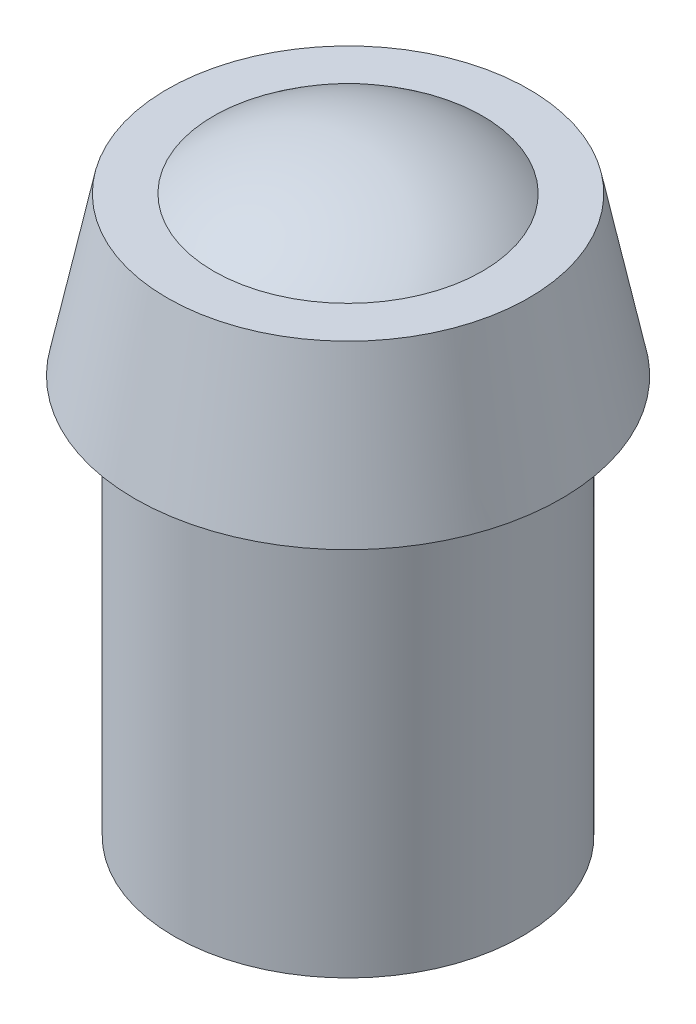
ISO-10303-21;
HEADER;
FILE_DESCRIPTION(('STEP AP214'),'2;1');
FILE_NAME('part.step','',(''),(''),'','','');
FILE_SCHEMA(('AUTOMOTIVE_DESIGN { 1 0 10303 214 1 1 1 1 }'));
ENDSEC;
DATA;
#1=APPLICATION_CONTEXT('core data for automotive mechanical design processes');
#2=APPLICATION_PROTOCOL_DEFINITION('international standard','automotive_design',2000,#1);
#3=PRODUCT_CONTEXT('',#1,'mechanical');
#4=PRODUCT('Part','Part','',(#3));
#5=PRODUCT_RELATED_PRODUCT_CATEGORY('part','',(#4));
#6=PRODUCT_DEFINITION_FORMATION('','',#4);
#7=PRODUCT_DEFINITION_CONTEXT('part definition',#1,'design');
#8=PRODUCT_DEFINITION('design','',#6,#7);
#9=PRODUCT_DEFINITION_SHAPE('','',#8);
#10=(LENGTH_UNIT() NAMED_UNIT(*) SI_UNIT(.MILLI.,.METRE.));
#11=(NAMED_UNIT(*) PLANE_ANGLE_UNIT() SI_UNIT($,.RADIAN.));
#12=(NAMED_UNIT(*) SI_UNIT($,.STERADIAN.) SOLID_ANGLE_UNIT());
#13=UNCERTAINTY_MEASURE_WITH_UNIT(LENGTH_MEASURE(1.E-05),#10,'distance_accuracy_value','');
#14=(GEOMETRIC_REPRESENTATION_CONTEXT(3) GLOBAL_UNCERTAINTY_ASSIGNED_CONTEXT((#13)) GLOBAL_UNIT_ASSIGNED_CONTEXT((#10,
#11,#12)) REPRESENTATION_CONTEXT('',''));
#15=CARTESIAN_POINT('',(0.,0.,0.));
#16=DIRECTION('',(0.,0.,1.));
#17=DIRECTION('',(1.,0.,0.));
#18=AXIS2_PLACEMENT_3D('',#15,#16,#17);
#19=CARTESIAN_POINT('',(0.,0.,0.));
#20=DIRECTION('',(0.,-1.,0.));
#21=DIRECTION('',(0.,0.,-1.));
#22=AXIS2_PLACEMENT_3D('',#19,#20,#21);
#23=PLANE('',#22);
#24=CARTESIAN_POINT('',(0.,0.,0.));
#25=DIRECTION('',(0.,1.,0.));
#26=DIRECTION('',(0.,0.,1.));
#27=AXIS2_PLACEMENT_3D('',#24,#25,#26);
#28=CIRCLE('',#27,2.9);
#29=CARTESIAN_POINT('',(0.,0.,2.9));
#30=VERTEX_POINT('',#29);
#31=EDGE_CURVE('E62',#30,#30,#28,.T.);
#32=ORIENTED_EDGE('',*,*,#31,.F.);
#33=EDGE_LOOP('',(#32));
#34=FACE_BOUND('',#33,.T.);
#35=CARTESIAN_POINT('',(0.,0.,0.));
#36=DIRECTION('',(0.,1.,0.));
#37=DIRECTION('',(0.,0.,1.));
#38=AXIS2_PLACEMENT_3D('',#35,#36,#37);
#39=CIRCLE('',#38,3.9);
#40=CARTESIAN_POINT('',(0.,0.,3.9));
#41=VERTEX_POINT('',#40);
#42=EDGE_CURVE('E10',#41,#41,#39,.T.);
#43=ORIENTED_EDGE('',*,*,#42,.T.);
#44=EDGE_LOOP('',(#43));
#45=FACE_BOUND('',#44,.T.);
#46=ADVANCED_FACE('F43',(#34,#45),#23,.F.);
#47=CARTESIAN_POINT('',(0.,-3.4,0.));
#48=DIRECTION('',(0.,-1.,0.));
#49=DIRECTION('',(0.,0.,-1.));
#50=AXIS2_PLACEMENT_3D('',#47,#48,#49);
#51=CONICAL_SURFACE('',#50,4.6,0.203045217253465);
#52=ORIENTED_EDGE('',*,*,#42,.F.);
#53=EDGE_LOOP('',(#52));
#54=FACE_BOUND('',#53,.T.);
#55=CARTESIAN_POINT('',(0.,-3.4,0.));
#56=DIRECTION('',(0.,1.,0.));
#57=DIRECTION('',(0.,0.,1.));
#58=AXIS2_PLACEMENT_3D('',#55,#56,#57);
#59=CIRCLE('',#58,4.6);
#60=CARTESIAN_POINT('',(0.,-3.4,4.6));
#61=VERTEX_POINT('',#60);
#62=EDGE_CURVE('E49',#61,#61,#59,.T.);
#63=ORIENTED_EDGE('',*,*,#62,.T.);
#64=EDGE_LOOP('',(#63));
#65=FACE_BOUND('',#64,.T.);
#66=ADVANCED_FACE('F69',(#54,#65),#51,.T.);
#67=CARTESIAN_POINT('',(4.6,-3.4,0.));
#68=DIRECTION('',(0.,1.,0.));
#69=DIRECTION('',(0.,0.,1.));
#70=AXIS2_PLACEMENT_3D('',#67,#68,#69);
#71=PLANE('',#70);
#72=ORIENTED_EDGE('',*,*,#62,.F.);
#73=EDGE_LOOP('',(#72));
#74=FACE_BOUND('',#73,.T.);
#75=CARTESIAN_POINT('',(0.,-3.4,0.));
#76=DIRECTION('',(0.,1.,0.));
#77=DIRECTION('',(0.,0.,1.));
#78=AXIS2_PLACEMENT_3D('',#75,#76,#77);
#79=CIRCLE('',#78,3.75);
#80=CARTESIAN_POINT('',(0.,-3.4,3.75));
#81=VERTEX_POINT('',#80);
#82=EDGE_CURVE('E53',#81,#81,#79,.T.);
#83=ORIENTED_EDGE('',*,*,#82,.T.);
#84=EDGE_LOOP('',(#83));
#85=FACE_BOUND('',#84,.T.);
#86=ADVANCED_FACE('F73',(#74,#85),#71,.F.);
#87=CARTESIAN_POINT('',(0.,0.,0.));
#88=DIRECTION('',(0.,1.,0.));
#89=DIRECTION('',(0.,0.,1.));
#90=AXIS2_PLACEMENT_3D('',#87,#88,#89);
#91=CYLINDRICAL_SURFACE('',#90,3.75);
#92=ORIENTED_EDGE('',*,*,#82,.F.);
#93=EDGE_LOOP('',(#92));
#94=FACE_BOUND('',#93,.T.);
#95=CARTESIAN_POINT('',(0.,-12.,0.));
#96=DIRECTION('',(0.,1.,0.));
#97=DIRECTION('',(0.,0.,1.));
#98=AXIS2_PLACEMENT_3D('',#95,#96,#97);
#99=CIRCLE('',#98,3.75);
#100=CARTESIAN_POINT('',(0.,-12.,3.75));
#101=VERTEX_POINT('',#100);
#102=EDGE_CURVE('E57',#101,#101,#99,.T.);
#103=ORIENTED_EDGE('',*,*,#102,.T.);
#104=EDGE_LOOP('',(#103));
#105=FACE_BOUND('',#104,.T.);
#106=ADVANCED_FACE('F78',(#94,#105),#91,.T.);
#107=CARTESIAN_POINT('',(3.75,-12.,0.));
#108=DIRECTION('',(0.,1.,0.));
#109=DIRECTION('',(0.,0.,1.));
#110=AXIS2_PLACEMENT_3D('',#107,#108,#109);
#111=PLANE('',#110);
#112=ORIENTED_EDGE('',*,*,#102,.F.);
#113=EDGE_LOOP('',(#112));
#114=FACE_BOUND('',#113,.T.);
#115=ADVANCED_FACE('F84',(#114),#111,.F.);
#116=CARTESIAN_POINT('',(0.,-3.705,0.));
#117=DIRECTION('',(0.,1.,0.));
#118=DIRECTION('',(1.,0.,0.));
#119=AXIS2_PLACEMENT_3D('',#116,#117,#118);
#120=SPHERICAL_SURFACE('',#119,4.705);
#121=ORIENTED_EDGE('',*,*,#31,.T.);
#122=EDGE_LOOP('',(#121));
#123=FACE_BOUND('',#122,.T.);
#124=ADVANCED_FACE('F66',(#123),#120,.T.);
#125=CLOSED_SHELL('',(#46,#66,#86,#106,#115,#124));
#126=MANIFOLD_SOLID_BREP('B2',#125);
#127=ADVANCED_BREP_SHAPE_REPRESENTATION('',(#18,#126),#14);
#128=SHAPE_DEFINITION_REPRESENTATION(#9,#127);
ENDSEC;
END-ISO-10303-21;
